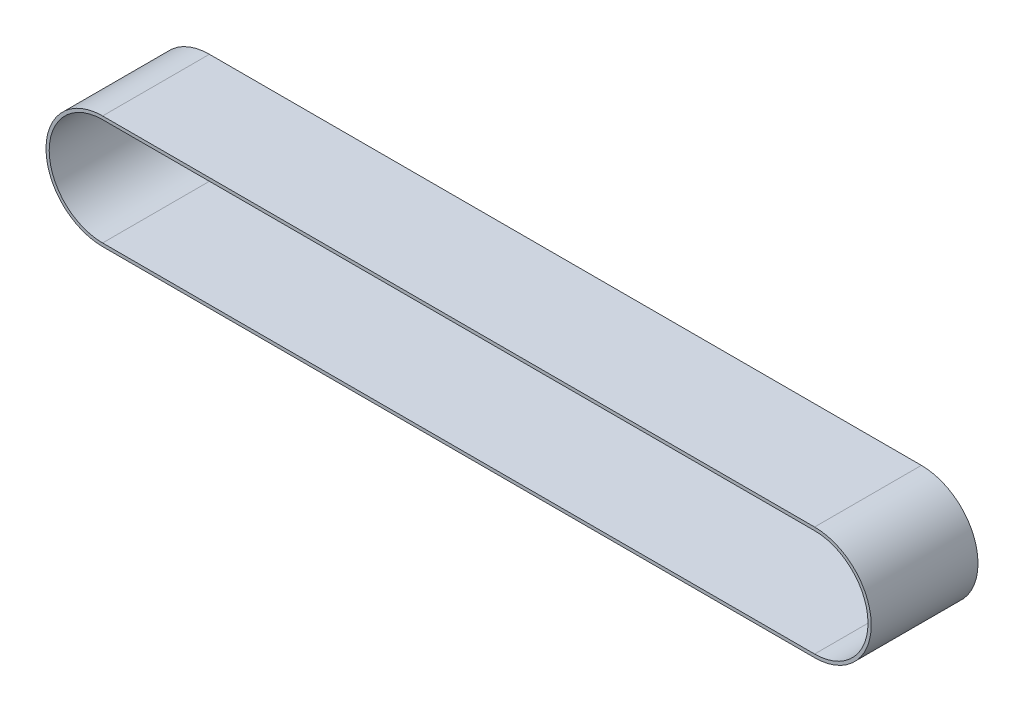
ISO-10303-21;
HEADER;
FILE_DESCRIPTION(('STEP AP214'),'2;1');
FILE_NAME('part.step','',(''),(''),'','','');
FILE_SCHEMA(('AUTOMOTIVE_DESIGN { 1 0 10303 214 1 1 1 1 }'));
ENDSEC;
DATA;
#1=APPLICATION_CONTEXT('core data for automotive mechanical design processes');
#2=APPLICATION_PROTOCOL_DEFINITION('international standard','automotive_design',2000,#1);
#3=PRODUCT_CONTEXT('',#1,'mechanical');
#4=PRODUCT('Part','Part','',(#3));
#5=PRODUCT_RELATED_PRODUCT_CATEGORY('part','',(#4));
#6=PRODUCT_DEFINITION_FORMATION('','',#4);
#7=PRODUCT_DEFINITION_CONTEXT('part definition',#1,'design');
#8=PRODUCT_DEFINITION('design','',#6,#7);
#9=PRODUCT_DEFINITION_SHAPE('','',#8);
#10=(LENGTH_UNIT() NAMED_UNIT(*) SI_UNIT(.MILLI.,.METRE.));
#11=(NAMED_UNIT(*) PLANE_ANGLE_UNIT() SI_UNIT($,.RADIAN.));
#12=(NAMED_UNIT(*) SI_UNIT($,.STERADIAN.) SOLID_ANGLE_UNIT());
#13=UNCERTAINTY_MEASURE_WITH_UNIT(LENGTH_MEASURE(1.E-05),#10,'distance_accuracy_value','');
#14=(GEOMETRIC_REPRESENTATION_CONTEXT(3) GLOBAL_UNCERTAINTY_ASSIGNED_CONTEXT((#13)) GLOBAL_UNIT_ASSIGNED_CONTEXT((#10,
#11,#12)) REPRESENTATION_CONTEXT('',''));
#15=CARTESIAN_POINT('',(0.,0.,0.));
#16=DIRECTION('',(0.,0.,1.));
#17=DIRECTION('',(1.,0.,0.));
#18=AXIS2_PLACEMENT_3D('',#15,#16,#17);
#19=CARTESIAN_POINT('',(0.,0.,30.));
#20=DIRECTION('',(0.,0.,1.));
#21=DIRECTION('',(1.,0.,0.));
#22=AXIS2_PLACEMENT_3D('',#19,#20,#21);
#23=PLANE('',#22);
#24=CARTESIAN_POINT('',(0.,0.,30.));
#25=DIRECTION('',(0.,0.,1.));
#26=DIRECTION('',(1.,0.,0.));
#27=AXIS2_PLACEMENT_3D('',#24,#25,#26);
#28=CIRCLE('',#27,15.9);
#29=CARTESIAN_POINT('',(0.,15.9,30.));
#30=VERTEX_POINT('',#29);
#31=CARTESIAN_POINT('',(0.,-15.9,30.));
#32=VERTEX_POINT('',#31);
#33=EDGE_CURVE('E136',#30,#32,#28,.T.);
#34=ORIENTED_EDGE('',*,*,#33,.T.);
#35=DIRECTION('',(1.,0.,0.));
#36=VECTOR('',#35,1.);
#37=CARTESIAN_POINT('',(0.,-15.9,30.));
#38=LINE('',#37,#36);
#39=CARTESIAN_POINT('',(200.,-15.9,30.));
#40=VERTEX_POINT('',#39);
#41=EDGE_CURVE('E139',#32,#40,#38,.T.);
#42=ORIENTED_EDGE('',*,*,#41,.T.);
#43=CARTESIAN_POINT('',(200.,0.,30.));
#44=DIRECTION('',(0.,0.,1.));
#45=DIRECTION('',(1.,0.,0.));
#46=AXIS2_PLACEMENT_3D('',#43,#44,#45);
#47=CIRCLE('',#46,15.9);
#48=CARTESIAN_POINT('',(200.,15.9,30.));
#49=VERTEX_POINT('',#48);
#50=EDGE_CURVE('E142',#40,#49,#47,.T.);
#51=ORIENTED_EDGE('',*,*,#50,.T.);
#52=DIRECTION('',(-1.,0.,0.));
#53=VECTOR('',#52,1.);
#54=CARTESIAN_POINT('',(200.,15.9,30.));
#55=LINE('',#54,#53);
#56=EDGE_CURVE('E144',#49,#30,#55,.T.);
#57=ORIENTED_EDGE('',*,*,#56,.T.);
#58=EDGE_LOOP('',(#34,#42,#51,#57));
#59=FACE_BOUND('',#58,.T.);
#60=DIRECTION('',(1.,0.,0.));
#61=VECTOR('',#60,1.);
#62=CARTESIAN_POINT('',(0.,-15.,30.));
#63=LINE('',#62,#61);
#64=CARTESIAN_POINT('',(0.,-15.,30.));
#65=VERTEX_POINT('',#64);
#66=CARTESIAN_POINT('',(200.,-15.,30.));
#67=VERTEX_POINT('',#66);
#68=EDGE_CURVE('E108',#65,#67,#63,.T.);
#69=ORIENTED_EDGE('',*,*,#68,.F.);
#70=CARTESIAN_POINT('',(0.,0.,30.));
#71=DIRECTION('',(0.,0.,1.));
#72=DIRECTION('',(1.,0.,0.));
#73=AXIS2_PLACEMENT_3D('',#70,#71,#72);
#74=CIRCLE('',#73,15.);
#75=CARTESIAN_POINT('',(0.,15.,30.));
#76=VERTEX_POINT('',#75);
#77=EDGE_CURVE('E100',#76,#65,#74,.T.);
#78=ORIENTED_EDGE('',*,*,#77,.F.);
#79=DIRECTION('',(-1.,0.,0.));
#80=VECTOR('',#79,1.);
#81=CARTESIAN_POINT('',(200.,15.,30.));
#82=LINE('',#81,#80);
#83=CARTESIAN_POINT('',(200.,15.,30.));
#84=VERTEX_POINT('',#83);
#85=EDGE_CURVE('E122',#84,#76,#82,.T.);
#86=ORIENTED_EDGE('',*,*,#85,.F.);
#87=CARTESIAN_POINT('',(200.,0.,30.));
#88=DIRECTION('',(0.,0.,1.));
#89=DIRECTION('',(1.,0.,0.));
#90=AXIS2_PLACEMENT_3D('',#87,#88,#89);
#91=CIRCLE('',#90,15.);
#92=EDGE_CURVE('E120',#67,#84,#91,.T.);
#93=ORIENTED_EDGE('',*,*,#92,.F.);
#94=EDGE_LOOP('',(#69,#78,#86,#93));
#95=FACE_BOUND('',#94,.T.);
#96=ADVANCED_FACE('F35',(#59,#95),#23,.T.);
#97=CARTESIAN_POINT('',(0.,0.,0.));
#98=DIRECTION('',(0.,0.,1.));
#99=DIRECTION('',(1.,0.,0.));
#100=AXIS2_PLACEMENT_3D('',#97,#98,#99);
#101=PLANE('',#100);
#102=CARTESIAN_POINT('',(0.,0.,0.));
#103=DIRECTION('',(0.,0.,1.));
#104=DIRECTION('',(1.,0.,0.));
#105=AXIS2_PLACEMENT_3D('',#102,#103,#104);
#106=CIRCLE('',#105,15.9);
#107=CARTESIAN_POINT('',(0.,15.9,0.));
#108=VERTEX_POINT('',#107);
#109=CARTESIAN_POINT('',(0.,-15.9,0.));
#110=VERTEX_POINT('',#109);
#111=EDGE_CURVE('E116',#108,#110,#106,.T.);
#112=ORIENTED_EDGE('',*,*,#111,.F.);
#113=DIRECTION('',(-1.,0.,0.));
#114=VECTOR('',#113,1.);
#115=CARTESIAN_POINT('',(200.,15.9,0.));
#116=LINE('',#115,#114);
#117=CARTESIAN_POINT('',(200.,15.9,0.));
#118=VERTEX_POINT('',#117);
#119=EDGE_CURVE('E140',#118,#108,#116,.T.);
#120=ORIENTED_EDGE('',*,*,#119,.F.);
#121=CARTESIAN_POINT('',(200.,0.,0.));
#122=DIRECTION('',(0.,0.,1.));
#123=DIRECTION('',(1.,0.,0.));
#124=AXIS2_PLACEMENT_3D('',#121,#122,#123);
#125=CIRCLE('',#124,15.9);
#126=CARTESIAN_POINT('',(200.,-15.9,0.));
#127=VERTEX_POINT('',#126);
#128=EDGE_CURVE('E151',#127,#118,#125,.T.);
#129=ORIENTED_EDGE('',*,*,#128,.F.);
#130=DIRECTION('',(1.,0.,0.));
#131=VECTOR('',#130,1.);
#132=CARTESIAN_POINT('',(0.,-15.9,0.));
#133=LINE('',#132,#131);
#134=EDGE_CURVE('E149',#110,#127,#133,.T.);
#135=ORIENTED_EDGE('',*,*,#134,.F.);
#136=EDGE_LOOP('',(#112,#120,#129,#135));
#137=FACE_BOUND('',#136,.T.);
#138=CARTESIAN_POINT('',(0.,0.,0.));
#139=DIRECTION('',(0.,0.,1.));
#140=DIRECTION('',(1.,0.,0.));
#141=AXIS2_PLACEMENT_3D('',#138,#139,#140);
#142=CIRCLE('',#141,15.);
#143=CARTESIAN_POINT('',(0.,15.,0.));
#144=VERTEX_POINT('',#143);
#145=CARTESIAN_POINT('',(0.,-15.,0.));
#146=VERTEX_POINT('',#145);
#147=EDGE_CURVE('E58',#144,#146,#142,.T.);
#148=ORIENTED_EDGE('',*,*,#147,.T.);
#149=DIRECTION('',(1.,0.,0.));
#150=VECTOR('',#149,1.);
#151=CARTESIAN_POINT('',(0.,-15.,0.));
#152=LINE('',#151,#150);
#153=CARTESIAN_POINT('',(200.,-15.,0.));
#154=VERTEX_POINT('',#153);
#155=EDGE_CURVE('E115',#146,#154,#152,.T.);
#156=ORIENTED_EDGE('',*,*,#155,.T.);
#157=CARTESIAN_POINT('',(200.,0.,0.));
#158=DIRECTION('',(0.,0.,1.));
#159=DIRECTION('',(1.,0.,0.));
#160=AXIS2_PLACEMENT_3D('',#157,#158,#159);
#161=CIRCLE('',#160,15.);
#162=CARTESIAN_POINT('',(200.,15.,0.));
#163=VERTEX_POINT('',#162);
#164=EDGE_CURVE('E128',#154,#163,#161,.T.);
#165=ORIENTED_EDGE('',*,*,#164,.T.);
#166=DIRECTION('',(-1.,0.,0.));
#167=VECTOR('',#166,1.);
#168=CARTESIAN_POINT('',(200.,15.,0.));
#169=LINE('',#168,#167);
#170=EDGE_CURVE('E109',#163,#144,#169,.T.);
#171=ORIENTED_EDGE('',*,*,#170,.T.);
#172=EDGE_LOOP('',(#148,#156,#165,#171));
#173=FACE_BOUND('',#172,.T.);
#174=ADVANCED_FACE('F169',(#137,#173),#101,.F.);
#175=CARTESIAN_POINT('',(0.,0.,30.));
#176=DIRECTION('',(0.,0.,-1.));
#177=DIRECTION('',(-1.,0.,0.));
#178=AXIS2_PLACEMENT_3D('',#175,#176,#177);
#179=CYLINDRICAL_SURFACE('',#178,15.9);
#180=ORIENTED_EDGE('',*,*,#111,.T.);
#181=DIRECTION('',(0.,0.,-1.));
#182=VECTOR('',#181,1.);
#183=CARTESIAN_POINT('',(0.,-15.9,30.));
#184=LINE('',#183,#182);
#185=EDGE_CURVE('E11',#32,#110,#184,.T.);
#186=ORIENTED_EDGE('',*,*,#185,.F.);
#187=ORIENTED_EDGE('',*,*,#33,.F.);
#188=DIRECTION('',(0.,0.,-1.));
#189=VECTOR('',#188,1.);
#190=CARTESIAN_POINT('',(0.,15.9,30.));
#191=LINE('',#190,#189);
#192=EDGE_CURVE('E146',#30,#108,#191,.T.);
#193=ORIENTED_EDGE('',*,*,#192,.T.);
#194=EDGE_LOOP('',(#180,#186,#187,#193));
#195=FACE_BOUND('',#194,.T.);
#196=ADVANCED_FACE('F37',(#195),#179,.T.);
#197=CARTESIAN_POINT('',(0.,-15.9,30.));
#198=DIRECTION('',(0.,1.,0.));
#199=DIRECTION('',(0.,0.,1.));
#200=AXIS2_PLACEMENT_3D('',#197,#198,#199);
#201=PLANE('',#200);
#202=ORIENTED_EDGE('',*,*,#134,.T.);
#203=DIRECTION('',(0.,0.,-1.));
#204=VECTOR('',#203,1.);
#205=CARTESIAN_POINT('',(200.,-15.9,30.));
#206=LINE('',#205,#204);
#207=EDGE_CURVE('E43',#40,#127,#206,.T.);
#208=ORIENTED_EDGE('',*,*,#207,.F.);
#209=ORIENTED_EDGE('',*,*,#41,.F.);
#210=ORIENTED_EDGE('',*,*,#185,.T.);
#211=EDGE_LOOP('',(#202,#208,#209,#210));
#212=FACE_BOUND('',#211,.T.);
#213=ADVANCED_FACE('F179',(#212),#201,.F.);
#214=CARTESIAN_POINT('',(200.,0.,30.));
#215=DIRECTION('',(0.,0.,-1.));
#216=DIRECTION('',(-1.,0.,0.));
#217=AXIS2_PLACEMENT_3D('',#214,#215,#216);
#218=CYLINDRICAL_SURFACE('',#217,15.9);
#219=ORIENTED_EDGE('',*,*,#128,.T.);
#220=DIRECTION('',(0.,0.,-1.));
#221=VECTOR('',#220,1.);
#222=CARTESIAN_POINT('',(200.,15.9,30.));
#223=LINE('',#222,#221);
#224=EDGE_CURVE('E156',#49,#118,#223,.T.);
#225=ORIENTED_EDGE('',*,*,#224,.F.);
#226=ORIENTED_EDGE('',*,*,#50,.F.);
#227=ORIENTED_EDGE('',*,*,#207,.T.);
#228=EDGE_LOOP('',(#219,#225,#226,#227));
#229=FACE_BOUND('',#228,.T.);
#230=ADVANCED_FACE('F163',(#229),#218,.T.);
#231=CARTESIAN_POINT('',(200.,15.9,30.));
#232=DIRECTION('',(0.,-1.,0.));
#233=DIRECTION('',(0.,0.,-1.));
#234=AXIS2_PLACEMENT_3D('',#231,#232,#233);
#235=PLANE('',#234);
#236=ORIENTED_EDGE('',*,*,#119,.T.);
#237=ORIENTED_EDGE('',*,*,#192,.F.);
#238=ORIENTED_EDGE('',*,*,#56,.F.);
#239=ORIENTED_EDGE('',*,*,#224,.T.);
#240=EDGE_LOOP('',(#236,#237,#238,#239));
#241=FACE_BOUND('',#240,.T.);
#242=ADVANCED_FACE('F173',(#241),#235,.F.);
#243=CARTESIAN_POINT('',(0.,0.,30.));
#244=DIRECTION('',(0.,0.,-1.));
#245=DIRECTION('',(-1.,0.,0.));
#246=AXIS2_PLACEMENT_3D('',#243,#244,#245);
#247=CYLINDRICAL_SURFACE('',#246,15.);
#248=ORIENTED_EDGE('',*,*,#147,.F.);
#249=DIRECTION('',(0.,0.,-1.));
#250=VECTOR('',#249,1.);
#251=CARTESIAN_POINT('',(0.,15.,30.));
#252=LINE('',#251,#250);
#253=EDGE_CURVE('E104',#76,#144,#252,.T.);
#254=ORIENTED_EDGE('',*,*,#253,.F.);
#255=ORIENTED_EDGE('',*,*,#77,.T.);
#256=DIRECTION('',(0.,0.,-1.));
#257=VECTOR('',#256,1.);
#258=CARTESIAN_POINT('',(0.,-15.,30.));
#259=LINE('',#258,#257);
#260=EDGE_CURVE('E103',#65,#146,#259,.T.);
#261=ORIENTED_EDGE('',*,*,#260,.T.);
#262=EDGE_LOOP('',(#248,#254,#255,#261));
#263=FACE_BOUND('',#262,.T.);
#264=ADVANCED_FACE('F102',(#263),#247,.F.);
#265=CARTESIAN_POINT('',(0.,-15.,30.));
#266=DIRECTION('',(0.,1.,0.));
#267=DIRECTION('',(0.,0.,1.));
#268=AXIS2_PLACEMENT_3D('',#265,#266,#267);
#269=PLANE('',#268);
#270=ORIENTED_EDGE('',*,*,#155,.F.);
#271=ORIENTED_EDGE('',*,*,#260,.F.);
#272=ORIENTED_EDGE('',*,*,#68,.T.);
#273=DIRECTION('',(0.,0.,-1.));
#274=VECTOR('',#273,1.);
#275=CARTESIAN_POINT('',(200.,-15.,30.));
#276=LINE('',#275,#274);
#277=EDGE_CURVE('E117',#67,#154,#276,.T.);
#278=ORIENTED_EDGE('',*,*,#277,.T.);
#279=EDGE_LOOP('',(#270,#271,#272,#278));
#280=FACE_BOUND('',#279,.T.);
#281=ADVANCED_FACE('F112',(#280),#269,.T.);
#282=CARTESIAN_POINT('',(200.,0.,30.));
#283=DIRECTION('',(0.,0.,-1.));
#284=DIRECTION('',(-1.,0.,0.));
#285=AXIS2_PLACEMENT_3D('',#282,#283,#284);
#286=CYLINDRICAL_SURFACE('',#285,15.);
#287=ORIENTED_EDGE('',*,*,#164,.F.);
#288=ORIENTED_EDGE('',*,*,#277,.F.);
#289=ORIENTED_EDGE('',*,*,#92,.T.);
#290=DIRECTION('',(0.,0.,-1.));
#291=VECTOR('',#290,1.);
#292=CARTESIAN_POINT('',(200.,15.,30.));
#293=LINE('',#292,#291);
#294=EDGE_CURVE('E50',#84,#163,#293,.T.);
#295=ORIENTED_EDGE('',*,*,#294,.T.);
#296=EDGE_LOOP('',(#287,#288,#289,#295));
#297=FACE_BOUND('',#296,.T.);
#298=ADVANCED_FACE('F202',(#297),#286,.F.);
#299=CARTESIAN_POINT('',(200.,15.,30.));
#300=DIRECTION('',(0.,-1.,0.));
#301=DIRECTION('',(0.,0.,-1.));
#302=AXIS2_PLACEMENT_3D('',#299,#300,#301);
#303=PLANE('',#302);
#304=ORIENTED_EDGE('',*,*,#170,.F.);
#305=ORIENTED_EDGE('',*,*,#294,.F.);
#306=ORIENTED_EDGE('',*,*,#85,.T.);
#307=ORIENTED_EDGE('',*,*,#253,.T.);
#308=EDGE_LOOP('',(#304,#305,#306,#307));
#309=FACE_BOUND('',#308,.T.);
#310=ADVANCED_FACE('F206',(#309),#303,.T.);
#311=CLOSED_SHELL('',(#96,#174,#196,#213,#230,#242,#264,#281,#298,#310));
#312=MANIFOLD_SOLID_BREP('B2',#311);
#313=ADVANCED_BREP_SHAPE_REPRESENTATION('',(#18,#312),#14);
#314=SHAPE_DEFINITION_REPRESENTATION(#9,#313);
ENDSEC;
END-ISO-10303-21;
